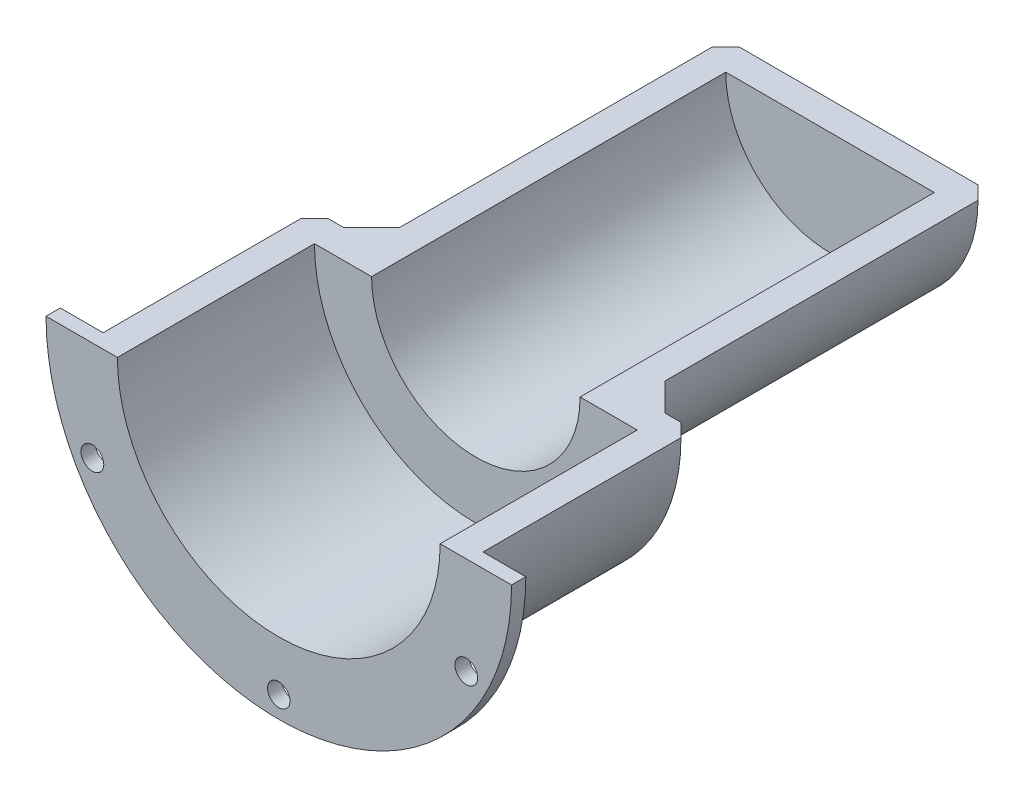
ISO-10303-21;
HEADER;
FILE_DESCRIPTION(('STEP AP214'),'2;1');
FILE_NAME('part.step','',(''),(''),'','','');
FILE_SCHEMA(('AUTOMOTIVE_DESIGN { 1 0 10303 214 1 1 1 1 }'));
ENDSEC;
DATA;
#1=APPLICATION_CONTEXT('core data for automotive mechanical design processes');
#2=APPLICATION_PROTOCOL_DEFINITION('international standard','automotive_design',2000,#1);
#3=PRODUCT_CONTEXT('',#1,'mechanical');
#4=PRODUCT('Part','Part','',(#3));
#5=PRODUCT_RELATED_PRODUCT_CATEGORY('part','',(#4));
#6=PRODUCT_DEFINITION_FORMATION('','',#4);
#7=PRODUCT_DEFINITION_CONTEXT('part definition',#1,'design');
#8=PRODUCT_DEFINITION('design','',#6,#7);
#9=PRODUCT_DEFINITION_SHAPE('','',#8);
#10=(LENGTH_UNIT() NAMED_UNIT(*) SI_UNIT(.MILLI.,.METRE.));
#11=(NAMED_UNIT(*) PLANE_ANGLE_UNIT() SI_UNIT($,.RADIAN.));
#12=(NAMED_UNIT(*) SI_UNIT($,.STERADIAN.) SOLID_ANGLE_UNIT());
#13=UNCERTAINTY_MEASURE_WITH_UNIT(LENGTH_MEASURE(1.E-05),#10,'distance_accuracy_value','');
#14=(GEOMETRIC_REPRESENTATION_CONTEXT(3) GLOBAL_UNCERTAINTY_ASSIGNED_CONTEXT((#13)) GLOBAL_UNIT_ASSIGNED_CONTEXT((#10,
#11,#12)) REPRESENTATION_CONTEXT('',''));
#15=CARTESIAN_POINT('',(0.,0.,0.));
#16=DIRECTION('',(0.,0.,1.));
#17=DIRECTION('',(1.,0.,0.));
#18=AXIS2_PLACEMENT_3D('',#15,#16,#17);
#19=CARTESIAN_POINT('',(0.,0.,40.132));
#20=DIRECTION('',(0.,0.,-1.));
#21=DIRECTION('',(-1.,0.,0.));
#22=AXIS2_PLACEMENT_3D('',#19,#20,#21);
#23=CYLINDRICAL_SURFACE('',#22,33.782);
#24=DIRECTION('',(0.,0.,-1.));
#25=VECTOR('',#24,1.);
#26=CARTESIAN_POINT('',(-33.782,0.,40.132));
#27=LINE('',#26,#25);
#28=CARTESIAN_POINT('',(-33.782,0.,37.592));
#29=VERTEX_POINT('',#28);
#30=CARTESIAN_POINT('',(-33.782,0.,2.38000000000001));
#31=VERTEX_POINT('',#30);
#32=EDGE_CURVE('E190',#29,#31,#27,.T.);
#33=ORIENTED_EDGE('',*,*,#32,.T.);
#34=CARTESIAN_POINT('',(0.,0.,2.38000000000001));
#35=DIRECTION('',(0.,0.,1.));
#36=DIRECTION('',(1.,0.,0.));
#37=AXIS2_PLACEMENT_3D('',#34,#35,#36);
#38=CIRCLE('',#37,33.782);
#39=CARTESIAN_POINT('',(33.782,0.,2.38000000000001));
#40=VERTEX_POINT('',#39);
#41=EDGE_CURVE('E261',#31,#40,#38,.T.);
#42=ORIENTED_EDGE('',*,*,#41,.T.);
#43=DIRECTION('',(0.,0.,-1.));
#44=VECTOR('',#43,1.);
#45=CARTESIAN_POINT('',(33.782,0.,40.132));
#46=LINE('',#45,#44);
#47=CARTESIAN_POINT('',(33.782,0.,37.592));
#48=VERTEX_POINT('',#47);
#49=EDGE_CURVE('E196',#48,#40,#46,.T.);
#50=ORIENTED_EDGE('',*,*,#49,.F.);
#51=CARTESIAN_POINT('',(0.,0.,37.592));
#52=DIRECTION('',(0.,0.,1.));
#53=DIRECTION('',(1.,0.,0.));
#54=AXIS2_PLACEMENT_3D('',#51,#52,#53);
#55=CIRCLE('',#54,33.782);
#56=EDGE_CURVE('E275',#29,#48,#55,.T.);
#57=ORIENTED_EDGE('',*,*,#56,.F.);
#58=EDGE_LOOP('',(#33,#42,#50,#57));
#59=FACE_BOUND('',#58,.T.);
#60=ADVANCED_FACE('F69',(#59),#23,.T.);
#61=CARTESIAN_POINT('',(0.,0.,5.08000000000001));
#62=DIRECTION('',(0.,0.,1.));
#63=DIRECTION('',(1.,0.,0.));
#64=AXIS2_PLACEMENT_3D('',#61,#62,#63);
#65=CYLINDRICAL_SURFACE('',#64,28.702);
#66=DIRECTION('',(0.,0.,1.));
#67=VECTOR('',#66,1.);
#68=CARTESIAN_POINT('',(-28.702,0.,5.08000000000001));
#69=LINE('',#68,#67);
#70=CARTESIAN_POINT('',(-28.702,0.,5.08000000000001));
#71=VERTEX_POINT('',#70);
#72=CARTESIAN_POINT('',(-28.702,0.,40.132));
#73=VERTEX_POINT('',#72);
#74=EDGE_CURVE('E174',#71,#73,#69,.T.);
#75=ORIENTED_EDGE('',*,*,#74,.T.);
#76=CARTESIAN_POINT('',(0.,0.,40.132));
#77=DIRECTION('',(0.,0.,1.));
#78=DIRECTION('',(1.,0.,0.));
#79=AXIS2_PLACEMENT_3D('',#76,#77,#78);
#80=CIRCLE('',#79,28.702);
#81=CARTESIAN_POINT('',(28.702,0.,40.132));
#82=VERTEX_POINT('',#81);
#83=EDGE_CURVE('E177',#73,#82,#80,.T.);
#84=ORIENTED_EDGE('',*,*,#83,.T.);
#85=DIRECTION('',(0.,0.,1.));
#86=VECTOR('',#85,1.);
#87=CARTESIAN_POINT('',(28.702,0.,5.08000000000001));
#88=LINE('',#87,#86);
#89=CARTESIAN_POINT('',(28.702,0.,5.08000000000001));
#90=VERTEX_POINT('',#89);
#91=EDGE_CURVE('E162',#90,#82,#88,.T.);
#92=ORIENTED_EDGE('',*,*,#91,.F.);
#93=CARTESIAN_POINT('',(0.,0.,5.08000000000001));
#94=DIRECTION('',(0.,0.,1.));
#95=DIRECTION('',(1.,0.,0.));
#96=AXIS2_PLACEMENT_3D('',#93,#94,#95);
#97=CIRCLE('',#96,28.702);
#98=EDGE_CURVE('E345',#71,#90,#97,.T.);
#99=ORIENTED_EDGE('',*,*,#98,.F.);
#100=EDGE_LOOP('',(#75,#84,#92,#99));
#101=FACE_BOUND('',#100,.T.);
#102=ADVANCED_FACE('F178',(#101),#65,.F.);
#103=CARTESIAN_POINT('',(0.,0.,-57.912));
#104=DIRECTION('',(0.,0.,1.));
#105=DIRECTION('',(1.,0.,0.));
#106=AXIS2_PLACEMENT_3D('',#103,#104,#105);
#107=CYLINDRICAL_SURFACE('',#106,18.542);
#108=CARTESIAN_POINT('',(0.,0.,5.08));
#109=DIRECTION('',(0.,0.,1.));
#110=DIRECTION('',(1.,0.,0.));
#111=AXIS2_PLACEMENT_3D('',#108,#109,#110);
#112=CIRCLE('',#111,18.542);
#113=CARTESIAN_POINT('',(18.542,0.,5.08));
#114=VERTEX_POINT('',#113);
#115=CARTESIAN_POINT('',(-18.542,0.,5.08));
#116=VERTEX_POINT('',#115);
#117=EDGE_CURVE('E228',#114,#116,#112,.F.);
#118=ORIENTED_EDGE('',*,*,#117,.F.);
#119=DIRECTION('',(0.,0.,1.));
#120=VECTOR('',#119,1.);
#121=CARTESIAN_POINT('',(18.542,0.,-57.912));
#122=LINE('',#121,#120);
#123=CARTESIAN_POINT('',(18.542,0.,-57.912));
#124=VERTEX_POINT('',#123);
#125=EDGE_CURVE('E213',#124,#114,#122,.T.);
#126=ORIENTED_EDGE('',*,*,#125,.F.);
#127=CARTESIAN_POINT('',(0.,0.,-57.912));
#128=DIRECTION('',(0.,0.,1.));
#129=DIRECTION('',(1.,0.,0.));
#130=AXIS2_PLACEMENT_3D('',#127,#128,#129);
#131=CIRCLE('',#130,18.542);
#132=CARTESIAN_POINT('',(-18.542,0.,-57.912));
#133=VERTEX_POINT('',#132);
#134=EDGE_CURVE('E206',#133,#124,#131,.T.);
#135=ORIENTED_EDGE('',*,*,#134,.F.);
#136=DIRECTION('',(0.,0.,1.));
#137=VECTOR('',#136,1.);
#138=CARTESIAN_POINT('',(-18.542,0.,-57.912));
#139=LINE('',#138,#137);
#140=EDGE_CURVE('E214',#133,#116,#139,.T.);
#141=ORIENTED_EDGE('',*,*,#140,.T.);
#142=EDGE_LOOP('',(#118,#126,#135,#141));
#143=FACE_BOUND('',#142,.T.);
#144=ADVANCED_FACE('F295',(#143),#107,.F.);
#145=CARTESIAN_POINT('',(0.,0.,-62.992));
#146=DIRECTION('',(0.,0.,1.));
#147=DIRECTION('',(1.,0.,0.));
#148=AXIS2_PLACEMENT_3D('',#145,#146,#147);
#149=CYLINDRICAL_SURFACE('',#148,23.622);
#150=DIRECTION('',(0.,0.,1.));
#151=VECTOR('',#150,1.);
#152=CARTESIAN_POINT('',(-23.622,0.,-62.992));
#153=LINE('',#152,#151);
#154=CARTESIAN_POINT('',(-23.622,0.,-60.612));
#155=VERTEX_POINT('',#154);
#156=CARTESIAN_POINT('',(-23.622,0.,-4.92000000000004));
#157=VERTEX_POINT('',#156);
#158=EDGE_CURVE('E224',#155,#157,#153,.T.);
#159=ORIENTED_EDGE('',*,*,#158,.F.);
#160=CARTESIAN_POINT('',(0.,0.,-60.612));
#161=DIRECTION('',(0.,0.,1.));
#162=DIRECTION('',(1.,0.,0.));
#163=AXIS2_PLACEMENT_3D('',#160,#161,#162);
#164=CIRCLE('',#163,23.622);
#165=CARTESIAN_POINT('',(23.622,0.,-60.612));
#166=VERTEX_POINT('',#165);
#167=EDGE_CURVE('E248',#155,#166,#164,.T.);
#168=ORIENTED_EDGE('',*,*,#167,.T.);
#169=DIRECTION('',(0.,0.,1.));
#170=VECTOR('',#169,1.);
#171=CARTESIAN_POINT('',(23.622,0.,-62.992));
#172=LINE('',#171,#170);
#173=CARTESIAN_POINT('',(23.622,0.,-4.92000000000004));
#174=VERTEX_POINT('',#173);
#175=EDGE_CURVE('E225',#166,#174,#172,.T.);
#176=ORIENTED_EDGE('',*,*,#175,.T.);
#177=CARTESIAN_POINT('',(0.,0.,-4.92000000000004));
#178=DIRECTION('',(0.,0.,1.));
#179=DIRECTION('',(1.,0.,0.));
#180=AXIS2_PLACEMENT_3D('',#177,#178,#179);
#181=CIRCLE('',#180,23.622);
#182=EDGE_CURVE('E237',#174,#157,#181,.F.);
#183=ORIENTED_EDGE('',*,*,#182,.T.);
#184=EDGE_LOOP('',(#159,#168,#176,#183));
#185=FACE_BOUND('',#184,.T.);
#186=ADVANCED_FACE('F308',(#185),#149,.T.);
#187=CARTESIAN_POINT('',(0.,0.,-62.992));
#188=DIRECTION('',(0.,-1.,0.));
#189=DIRECTION('',(0.,0.,-1.));
#190=AXIS2_PLACEMENT_3D('',#187,#188,#189);
#191=PLANE('',#190);
#192=ORIENTED_EDGE('',*,*,#49,.T.);
#193=DIRECTION('',(0.707106781186549,0.,0.707106781186546));
#194=VECTOR('',#193,1.);
#195=CARTESIAN_POINT('',(0.,0.,-31.4019999999999));
#196=LINE('',#195,#194);
#197=CARTESIAN_POINT('',(31.402,0.,0.));
#198=VERTEX_POINT('',#197);
#199=EDGE_CURVE('E79',#40,#198,#196,.F.);
#200=ORIENTED_EDGE('',*,*,#199,.T.);
#201=DIRECTION('',(-1.,0.,0.));
#202=VECTOR('',#201,1.);
#203=CARTESIAN_POINT('',(-33.782,0.,0.));
#204=LINE('',#203,#202);
#205=CARTESIAN_POINT('',(28.542,0.,0.));
#206=VERTEX_POINT('',#205);
#207=EDGE_CURVE('E198',#198,#206,#204,.T.);
#208=ORIENTED_EDGE('',*,*,#207,.T.);
#209=DIRECTION('',(0.707106781186544,0.,0.707106781186551));
#210=VECTOR('',#209,1.);
#211=CARTESIAN_POINT('',(0.,0.,-28.5420000000003));
#212=LINE('',#211,#210);
#213=EDGE_CURVE('E241',#206,#174,#212,.F.);
#214=ORIENTED_EDGE('',*,*,#213,.T.);
#215=ORIENTED_EDGE('',*,*,#175,.F.);
#216=DIRECTION('',(0.707106781186549,0.,0.707106781186546));
#217=VECTOR('',#216,1.);
#218=CARTESIAN_POINT('',(0.,0.,-84.2339999999999));
#219=LINE('',#218,#217);
#220=CARTESIAN_POINT('',(21.242,0.,-62.992));
#221=VERTEX_POINT('',#220);
#222=EDGE_CURVE('E255',#166,#221,#219,.F.);
#223=ORIENTED_EDGE('',*,*,#222,.T.);
#224=DIRECTION('',(1.,0.,0.));
#225=VECTOR('',#224,1.);
#226=CARTESIAN_POINT('',(0.,0.,-62.992));
#227=LINE('',#226,#225);
#228=CARTESIAN_POINT('',(-21.242,0.,-62.992));
#229=VERTEX_POINT('',#228);
#230=EDGE_CURVE('E218',#229,#221,#227,.T.);
#231=ORIENTED_EDGE('',*,*,#230,.F.);
#232=DIRECTION('',(0.707106781186549,0.,-0.707106781186546));
#233=VECTOR('',#232,1.);
#234=CARTESIAN_POINT('',(0.,0.,-84.2339999999999));
#235=LINE('',#234,#233);
#236=EDGE_CURVE('E252',#229,#155,#235,.F.);
#237=ORIENTED_EDGE('',*,*,#236,.T.);
#238=ORIENTED_EDGE('',*,*,#158,.T.);
#239=DIRECTION('',(0.707106781186544,0.,-0.707106781186551));
#240=VECTOR('',#239,1.);
#241=CARTESIAN_POINT('',(0.,0.,-28.5420000000003));
#242=LINE('',#241,#240);
#243=CARTESIAN_POINT('',(-28.542,0.,0.));
#244=VERTEX_POINT('',#243);
#245=EDGE_CURVE('E245',#157,#244,#242,.F.);
#246=ORIENTED_EDGE('',*,*,#245,.T.);
#247=CARTESIAN_POINT('',(-31.402,0.,0.));
#248=VERTEX_POINT('',#247);
#249=EDGE_CURVE('E202',#244,#248,#204,.T.);
#250=ORIENTED_EDGE('',*,*,#249,.T.);
#251=DIRECTION('',(0.707106781186549,0.,-0.707106781186546));
#252=VECTOR('',#251,1.);
#253=CARTESIAN_POINT('',(0.,0.,-31.4019999999999));
#254=LINE('',#253,#252);
#255=EDGE_CURVE('E265',#248,#31,#254,.F.);
#256=ORIENTED_EDGE('',*,*,#255,.T.);
#257=ORIENTED_EDGE('',*,*,#32,.F.);
#258=DIRECTION('',(-1.,0.,0.));
#259=VECTOR('',#258,1.);
#260=CARTESIAN_POINT('',(-41.402,0.,37.592));
#261=LINE('',#260,#259);
#262=CARTESIAN_POINT('',(-41.402,0.,37.592));
#263=VERTEX_POINT('',#262);
#264=EDGE_CURVE('E364',#29,#263,#261,.T.);
#265=ORIENTED_EDGE('',*,*,#264,.T.);
#266=DIRECTION('',(0.,0.,1.));
#267=VECTOR('',#266,1.);
#268=CARTESIAN_POINT('',(-41.402,0.,37.592));
#269=LINE('',#268,#267);
#270=CARTESIAN_POINT('',(-41.402,0.,40.132));
#271=VERTEX_POINT('',#270);
#272=EDGE_CURVE('E350',#263,#271,#269,.T.);
#273=ORIENTED_EDGE('',*,*,#272,.T.);
#274=DIRECTION('',(-1.,0.,0.));
#275=VECTOR('',#274,1.);
#276=CARTESIAN_POINT('',(-33.782,0.,40.132));
#277=LINE('',#276,#275);
#278=EDGE_CURVE('E191',#73,#271,#277,.T.);
#279=ORIENTED_EDGE('',*,*,#278,.F.);
#280=ORIENTED_EDGE('',*,*,#74,.F.);
#281=DIRECTION('',(-1.,0.,0.));
#282=VECTOR('',#281,1.);
#283=CARTESIAN_POINT('',(-28.702,0.,5.08000000000001));
#284=LINE('',#283,#282);
#285=EDGE_CURVE('E344',#116,#71,#284,.T.);
#286=ORIENTED_EDGE('',*,*,#285,.F.);
#287=ORIENTED_EDGE('',*,*,#140,.F.);
#288=DIRECTION('',(-1.,0.,0.));
#289=VECTOR('',#288,1.);
#290=CARTESIAN_POINT('',(-18.542,0.,-57.912));
#291=LINE('',#290,#289);
#292=EDGE_CURVE('E209',#124,#133,#291,.T.);
#293=ORIENTED_EDGE('',*,*,#292,.F.);
#294=ORIENTED_EDGE('',*,*,#125,.T.);
#295=EDGE_CURVE('E169',#90,#114,#284,.T.);
#296=ORIENTED_EDGE('',*,*,#295,.F.);
#297=ORIENTED_EDGE('',*,*,#91,.T.);
#298=CARTESIAN_POINT('',(41.402,0.,40.132));
#299=VERTEX_POINT('',#298);
#300=EDGE_CURVE('E166',#299,#82,#277,.T.);
#301=ORIENTED_EDGE('',*,*,#300,.F.);
#302=DIRECTION('',(0.,0.,1.));
#303=VECTOR('',#302,1.);
#304=CARTESIAN_POINT('',(41.402,0.,37.592));
#305=LINE('',#304,#303);
#306=CARTESIAN_POINT('',(41.402,0.,37.592));
#307=VERTEX_POINT('',#306);
#308=EDGE_CURVE('E351',#307,#299,#305,.T.);
#309=ORIENTED_EDGE('',*,*,#308,.F.);
#310=EDGE_CURVE('E354',#307,#48,#261,.T.);
#311=ORIENTED_EDGE('',*,*,#310,.T.);
#312=EDGE_LOOP('',(#192,#200,#208,#214,#215,#223,#231,#237,#238,#246,#250,#256,#257,#265,#273,
#279,#280,#286,#287,#293,#294,#296,#297,#301,#309,#311));
#313=FACE_BOUND('',#312,.T.);
#314=ADVANCED_FACE('F164',(#313),#191,.F.);
#315=CARTESIAN_POINT('',(0.,0.,-62.992));
#316=DIRECTION('',(0.,0.,1.));
#317=DIRECTION('',(1.,0.,0.));
#318=AXIS2_PLACEMENT_3D('',#315,#316,#317);
#319=PLANE('',#318);
#320=ORIENTED_EDGE('',*,*,#230,.T.);
#321=CARTESIAN_POINT('',(0.,0.,-62.992));
#322=DIRECTION('',(0.,0.,1.));
#323=DIRECTION('',(1.,0.,0.));
#324=AXIS2_PLACEMENT_3D('',#321,#322,#323);
#325=CIRCLE('',#324,21.242);
#326=EDGE_CURVE('E258',#221,#229,#325,.F.);
#327=ORIENTED_EDGE('',*,*,#326,.T.);
#328=EDGE_LOOP('',(#320,#327));
#329=FACE_BOUND('',#328,.T.);
#330=ADVANCED_FACE('F304',(#329),#319,.F.);
#331=CARTESIAN_POINT('',(0.,0.,-57.912));
#332=DIRECTION('',(0.,0.,1.));
#333=DIRECTION('',(1.,0.,0.));
#334=AXIS2_PLACEMENT_3D('',#331,#332,#333);
#335=PLANE('',#334);
#336=ORIENTED_EDGE('',*,*,#134,.T.);
#337=ORIENTED_EDGE('',*,*,#292,.T.);
#338=EDGE_LOOP('',(#336,#337));
#339=FACE_BOUND('',#338,.T.);
#340=ADVANCED_FACE('F301',(#339),#335,.T.);
#341=CARTESIAN_POINT('',(0.,0.,40.132));
#342=DIRECTION('',(0.,0.,1.));
#343=DIRECTION('',(1.,0.,0.));
#344=AXIS2_PLACEMENT_3D('',#341,#342,#343);
#345=PLANE('',#344);
#346=CARTESIAN_POINT('',(-33.1564254473108,-17.7146807918439,40.132));
#347=DIRECTION('',(0.,0.,1.));
#348=DIRECTION('',(1.,0.,0.));
#349=AXIS2_PLACEMENT_3D('',#346,#347,#348);
#350=CIRCLE('',#349,2.032);
#351=CARTESIAN_POINT('',(-31.1244254473108,-17.7146807918439,40.132));
#352=VERTEX_POINT('',#351);
#353=EDGE_CURVE('E384',#352,#352,#350,.T.);
#354=ORIENTED_EDGE('',*,*,#353,.F.);
#355=EDGE_LOOP('',(#354));
#356=FACE_BOUND('',#355,.T.);
#357=CARTESIAN_POINT('',(33.3594053164859,-17.3294125962311,40.132));
#358=DIRECTION('',(0.,0.,1.));
#359=DIRECTION('',(1.,0.,0.));
#360=AXIS2_PLACEMENT_3D('',#357,#358,#359);
#361=CIRCLE('',#360,2.032);
#362=CARTESIAN_POINT('',(35.3914053164859,-17.3294125962311,40.132));
#363=VERTEX_POINT('',#362);
#364=EDGE_CURVE('E380',#363,#363,#361,.T.);
#365=ORIENTED_EDGE('',*,*,#364,.F.);
#366=EDGE_LOOP('',(#365));
#367=FACE_BOUND('',#366,.T.);
#368=CARTESIAN_POINT('',(0.,-37.592,40.132));
#369=DIRECTION('',(0.,0.,-1.));
#370=DIRECTION('',(-1.,0.,0.));
#371=AXIS2_PLACEMENT_3D('',#368,#369,#370);
#372=CIRCLE('',#371,2.);
#373=CARTESIAN_POINT('',(-2.,-37.592,40.132));
#374=VERTEX_POINT('',#373);
#375=EDGE_CURVE('E184',#374,#374,#372,.T.);
#376=ORIENTED_EDGE('',*,*,#375,.T.);
#377=EDGE_LOOP('',(#376));
#378=FACE_BOUND('',#377,.T.);
#379=ORIENTED_EDGE('',*,*,#83,.F.);
#380=ORIENTED_EDGE('',*,*,#278,.T.);
#381=CARTESIAN_POINT('',(0.,0.,40.132));
#382=DIRECTION('',(0.,0.,1.));
#383=DIRECTION('',(1.,0.,0.));
#384=AXIS2_PLACEMENT_3D('',#381,#382,#383);
#385=CIRCLE('',#384,41.402);
#386=EDGE_CURVE('E183',#271,#299,#385,.T.);
#387=ORIENTED_EDGE('',*,*,#386,.T.);
#388=ORIENTED_EDGE('',*,*,#300,.T.);
#389=EDGE_LOOP('',(#379,#380,#387,#388));
#390=FACE_BOUND('',#389,.T.);
#391=ADVANCED_FACE('F187',(#356,#367,#378,#390),#345,.T.);
#392=CARTESIAN_POINT('',(0.,0.,0.));
#393=DIRECTION('',(0.,0.,1.));
#394=DIRECTION('',(1.,0.,0.));
#395=AXIS2_PLACEMENT_3D('',#392,#393,#394);
#396=PLANE('',#395);
#397=ORIENTED_EDGE('',*,*,#207,.F.);
#398=CARTESIAN_POINT('',(0.,0.,0.));
#399=DIRECTION('',(0.,0.,1.));
#400=DIRECTION('',(1.,0.,0.));
#401=AXIS2_PLACEMENT_3D('',#398,#399,#400);
#402=CIRCLE('',#401,31.402);
#403=EDGE_CURVE('E12',#198,#248,#402,.F.);
#404=ORIENTED_EDGE('',*,*,#403,.T.);
#405=ORIENTED_EDGE('',*,*,#249,.F.);
#406=CARTESIAN_POINT('',(0.,0.,0.));
#407=DIRECTION('',(0.,0.,1.));
#408=DIRECTION('',(1.,0.,0.));
#409=AXIS2_PLACEMENT_3D('',#406,#407,#408);
#410=CIRCLE('',#409,28.542);
#411=EDGE_CURVE('E233',#244,#206,#410,.T.);
#412=ORIENTED_EDGE('',*,*,#411,.T.);
#413=EDGE_LOOP('',(#397,#404,#405,#412));
#414=FACE_BOUND('',#413,.T.);
#415=ADVANCED_FACE('F299',(#414),#396,.F.);
#416=CARTESIAN_POINT('',(0.,0.,5.08000000000001));
#417=DIRECTION('',(0.,0.,1.));
#418=DIRECTION('',(1.,0.,0.));
#419=AXIS2_PLACEMENT_3D('',#416,#417,#418);
#420=PLANE('',#419);
#421=ORIENTED_EDGE('',*,*,#117,.T.);
#422=ORIENTED_EDGE('',*,*,#285,.T.);
#423=ORIENTED_EDGE('',*,*,#98,.T.);
#424=ORIENTED_EDGE('',*,*,#295,.T.);
#425=EDGE_LOOP('',(#421,#422,#423,#424));
#426=FACE_BOUND('',#425,.T.);
#427=ADVANCED_FACE('F410',(#426),#420,.T.);
#428=CARTESIAN_POINT('',(0.,0.,37.592));
#429=DIRECTION('',(0.,0.,1.));
#430=DIRECTION('',(1.,0.,0.));
#431=AXIS2_PLACEMENT_3D('',#428,#429,#430);
#432=PLANE('',#431);
#433=CARTESIAN_POINT('',(-33.1564254473108,-17.7146807918439,37.592));
#434=DIRECTION('',(0.,0.,1.));
#435=DIRECTION('',(1.,0.,0.));
#436=AXIS2_PLACEMENT_3D('',#433,#434,#435);
#437=CIRCLE('',#436,2.032);
#438=CARTESIAN_POINT('',(-31.1244254473108,-17.7146807918439,37.592));
#439=VERTEX_POINT('',#438);
#440=EDGE_CURVE('E372',#439,#439,#437,.T.);
#441=ORIENTED_EDGE('',*,*,#440,.T.);
#442=EDGE_LOOP('',(#441));
#443=FACE_BOUND('',#442,.T.);
#444=CARTESIAN_POINT('',(33.3594053164859,-17.3294125962311,37.592));
#445=DIRECTION('',(0.,0.,1.));
#446=DIRECTION('',(1.,0.,0.));
#447=AXIS2_PLACEMENT_3D('',#444,#445,#446);
#448=CIRCLE('',#447,2.032);
#449=CARTESIAN_POINT('',(35.3914053164859,-17.3294125962311,37.592));
#450=VERTEX_POINT('',#449);
#451=EDGE_CURVE('E376',#450,#450,#448,.T.);
#452=ORIENTED_EDGE('',*,*,#451,.T.);
#453=EDGE_LOOP('',(#452));
#454=FACE_BOUND('',#453,.T.);
#455=CARTESIAN_POINT('',(0.,-37.592,37.592));
#456=DIRECTION('',(0.,0.,-1.));
#457=DIRECTION('',(-1.,0.,0.));
#458=AXIS2_PLACEMENT_3D('',#455,#456,#457);
#459=CIRCLE('',#458,2.);
#460=CARTESIAN_POINT('',(-2.,-37.592,37.592));
#461=VERTEX_POINT('',#460);
#462=EDGE_CURVE('E368',#461,#461,#459,.T.);
#463=ORIENTED_EDGE('',*,*,#462,.F.);
#464=EDGE_LOOP('',(#463));
#465=FACE_BOUND('',#464,.T.);
#466=ORIENTED_EDGE('',*,*,#264,.F.);
#467=ORIENTED_EDGE('',*,*,#56,.T.);
#468=ORIENTED_EDGE('',*,*,#310,.F.);
#469=CARTESIAN_POINT('',(0.,0.,37.592));
#470=DIRECTION('',(0.,0.,1.));
#471=DIRECTION('',(1.,0.,0.));
#472=AXIS2_PLACEMENT_3D('',#469,#470,#471);
#473=CIRCLE('',#472,41.402);
#474=EDGE_CURVE('E360',#263,#307,#473,.T.);
#475=ORIENTED_EDGE('',*,*,#474,.F.);
#476=EDGE_LOOP('',(#466,#467,#468,#475));
#477=FACE_BOUND('',#476,.T.);
#478=ADVANCED_FACE('F331',(#443,#454,#465,#477),#432,.F.);
#479=CARTESIAN_POINT('',(0.,0.,37.592));
#480=DIRECTION('',(0.,0.,1.));
#481=DIRECTION('',(1.,0.,0.));
#482=AXIS2_PLACEMENT_3D('',#479,#480,#481);
#483=CYLINDRICAL_SURFACE('',#482,41.402);
#484=ORIENTED_EDGE('',*,*,#386,.F.);
#485=ORIENTED_EDGE('',*,*,#272,.F.);
#486=ORIENTED_EDGE('',*,*,#474,.T.);
#487=ORIENTED_EDGE('',*,*,#308,.T.);
#488=EDGE_LOOP('',(#484,#485,#486,#487));
#489=FACE_BOUND('',#488,.T.);
#490=ADVANCED_FACE('F322',(#489),#483,.T.);
#491=CARTESIAN_POINT('',(0.,0.,0.));
#492=DIRECTION('',(0.,0.,1.));
#493=DIRECTION('',(1.,0.,0.));
#494=AXIS2_PLACEMENT_3D('',#491,#492,#493);
#495=CONICAL_SURFACE('',#494,28.542,0.785398163397443);
#496=ORIENTED_EDGE('',*,*,#245,.F.);
#497=ORIENTED_EDGE('',*,*,#182,.F.);
#498=ORIENTED_EDGE('',*,*,#213,.F.);
#499=ORIENTED_EDGE('',*,*,#411,.F.);
#500=EDGE_LOOP('',(#496,#497,#498,#499));
#501=FACE_BOUND('',#500,.T.);
#502=ADVANCED_FACE('F287',(#501),#495,.T.);
#503=CARTESIAN_POINT('',(0.,0.,-60.612));
#504=DIRECTION('',(0.,0.,1.));
#505=DIRECTION('',(1.,0.,0.));
#506=AXIS2_PLACEMENT_3D('',#503,#504,#505);
#507=CONICAL_SURFACE('',#506,23.622,0.78539816339745);
#508=ORIENTED_EDGE('',*,*,#236,.F.);
#509=ORIENTED_EDGE('',*,*,#326,.F.);
#510=ORIENTED_EDGE('',*,*,#222,.F.);
#511=ORIENTED_EDGE('',*,*,#167,.F.);
#512=EDGE_LOOP('',(#508,#509,#510,#511));
#513=FACE_BOUND('',#512,.T.);
#514=ADVANCED_FACE('F278',(#513),#507,.T.);
#515=CARTESIAN_POINT('',(0.,0.,2.38000000000001));
#516=DIRECTION('',(0.,0.,1.));
#517=DIRECTION('',(1.,0.,0.));
#518=AXIS2_PLACEMENT_3D('',#515,#516,#517);
#519=CONICAL_SURFACE('',#518,33.782,0.78539816339745);
#520=ORIENTED_EDGE('',*,*,#255,.F.);
#521=ORIENTED_EDGE('',*,*,#403,.F.);
#522=ORIENTED_EDGE('',*,*,#199,.F.);
#523=ORIENTED_EDGE('',*,*,#41,.F.);
#524=EDGE_LOOP('',(#520,#521,#522,#523));
#525=FACE_BOUND('',#524,.T.);
#526=ADVANCED_FACE('F72',(#525),#519,.T.);
#527=CARTESIAN_POINT('',(0.,-37.592,40.132));
#528=DIRECTION('',(0.,0.,-1.));
#529=DIRECTION('',(-1.,0.,0.));
#530=AXIS2_PLACEMENT_3D('',#527,#528,#529);
#531=CYLINDRICAL_SURFACE('',#530,2.);
#532=ORIENTED_EDGE('',*,*,#375,.F.);
#533=EDGE_LOOP('',(#532));
#534=FACE_BOUND('',#533,.T.);
#535=ORIENTED_EDGE('',*,*,#462,.T.);
#536=EDGE_LOOP('',(#535));
#537=FACE_BOUND('',#536,.T.);
#538=ADVANCED_FACE('F277',(#534,#537),#531,.F.);
#539=CARTESIAN_POINT('',(33.3594053164859,-17.3294125962311,37.592));
#540=DIRECTION('',(0.,0.,1.));
#541=DIRECTION('',(1.,0.,0.));
#542=AXIS2_PLACEMENT_3D('',#539,#540,#541);
#543=CYLINDRICAL_SURFACE('',#542,2.032);
#544=ORIENTED_EDGE('',*,*,#451,.F.);
#545=EDGE_LOOP('',(#544));
#546=FACE_BOUND('',#545,.T.);
#547=ORIENTED_EDGE('',*,*,#364,.T.);
#548=EDGE_LOOP('',(#547));
#549=FACE_BOUND('',#548,.T.);
#550=ADVANCED_FACE('F283',(#546,#549),#543,.F.);
#551=CARTESIAN_POINT('',(-33.1564254473108,-17.7146807918439,37.592));
#552=DIRECTION('',(0.,0.,1.));
#553=DIRECTION('',(1.,0.,0.));
#554=AXIS2_PLACEMENT_3D('',#551,#552,#553);
#555=CYLINDRICAL_SURFACE('',#554,2.032);
#556=ORIENTED_EDGE('',*,*,#440,.F.);
#557=EDGE_LOOP('',(#556));
#558=FACE_BOUND('',#557,.T.);
#559=ORIENTED_EDGE('',*,*,#353,.T.);
#560=EDGE_LOOP('',(#559));
#561=FACE_BOUND('',#560,.T.);
#562=ADVANCED_FACE('F394',(#558,#561),#555,.F.);
#563=CLOSED_SHELL('',(#60,#102,#144,#186,#314,#330,#340,#391,#415,#427,#478,#490,#502,#514,#526,
#538,#550,#562));
#564=MANIFOLD_SOLID_BREP('B2',#563);
#565=ADVANCED_BREP_SHAPE_REPRESENTATION('',(#18,#564),#14);
#566=SHAPE_DEFINITION_REPRESENTATION(#9,#565);
ENDSEC;
END-ISO-10303-21;
